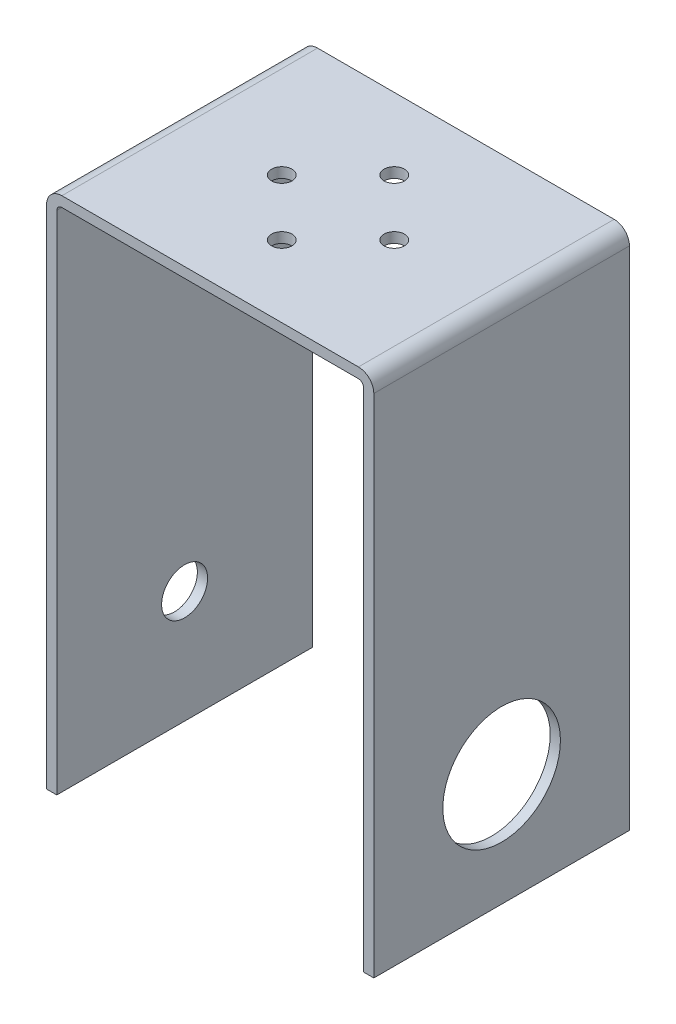
ISO-10303-21;
HEADER;
FILE_DESCRIPTION(('STEP AP214'),'2;1');
FILE_NAME('part.step','',(''),(''),'','','');
FILE_SCHEMA(('AUTOMOTIVE_DESIGN { 1 0 10303 214 1 1 1 1 }'));
ENDSEC;
DATA;
#1=APPLICATION_CONTEXT('core data for automotive mechanical design processes');
#2=APPLICATION_PROTOCOL_DEFINITION('international standard','automotive_design',2000,#1);
#3=PRODUCT_CONTEXT('',#1,'mechanical');
#4=PRODUCT('Part','Part','',(#3));
#5=PRODUCT_RELATED_PRODUCT_CATEGORY('part','',(#4));
#6=PRODUCT_DEFINITION_FORMATION('','',#4);
#7=PRODUCT_DEFINITION_CONTEXT('part definition',#1,'design');
#8=PRODUCT_DEFINITION('design','',#6,#7);
#9=PRODUCT_DEFINITION_SHAPE('','',#8);
#10=(LENGTH_UNIT() NAMED_UNIT(*) SI_UNIT(.MILLI.,.METRE.));
#11=(NAMED_UNIT(*) PLANE_ANGLE_UNIT() SI_UNIT($,.RADIAN.));
#12=(NAMED_UNIT(*) SI_UNIT($,.STERADIAN.) SOLID_ANGLE_UNIT());
#13=UNCERTAINTY_MEASURE_WITH_UNIT(LENGTH_MEASURE(1.E-05),#10,'distance_accuracy_value','');
#14=(GEOMETRIC_REPRESENTATION_CONTEXT(3) GLOBAL_UNCERTAINTY_ASSIGNED_CONTEXT((#13)) GLOBAL_UNIT_ASSIGNED_CONTEXT((#10,
#11,#12)) REPRESENTATION_CONTEXT('',''));
#15=CARTESIAN_POINT('',(0.,0.,0.));
#16=DIRECTION('',(0.,0.,1.));
#17=DIRECTION('',(1.,0.,0.));
#18=AXIS2_PLACEMENT_3D('',#15,#16,#17);
#19=CARTESIAN_POINT('',(30.,-50.,50.));
#20=DIRECTION('',(1.,0.,0.));
#21=DIRECTION('',(0.,0.,-1.));
#22=AXIS2_PLACEMENT_3D('',#19,#20,#21);
#23=PLANE('',#22);
#24=CARTESIAN_POINT('',(30.,-28.,25.));
#25=DIRECTION('',(1.,0.,0.));
#26=DIRECTION('',(0.,0.,-1.));
#27=AXIS2_PLACEMENT_3D('',#24,#25,#26);
#28=CIRCLE('',#27,11.5);
#29=CARTESIAN_POINT('',(30.,-28.,13.5));
#30=VERTEX_POINT('',#29);
#31=EDGE_CURVE('E357',#30,#30,#28,.T.);
#32=ORIENTED_EDGE('',*,*,#31,.T.);
#33=EDGE_LOOP('',(#32));
#34=FACE_BOUND('',#33,.T.);
#35=DIRECTION('',(0.,-1.,0.));
#36=VECTOR('',#35,1.);
#37=CARTESIAN_POINT('',(30.,-50.,50.));
#38=LINE('',#37,#36);
#39=CARTESIAN_POINT('',(30.,49.,50.));
#40=VERTEX_POINT('',#39);
#41=CARTESIAN_POINT('',(30.,-50.,50.));
#42=VERTEX_POINT('',#41);
#43=EDGE_CURVE('E137',#40,#42,#38,.T.);
#44=ORIENTED_EDGE('',*,*,#43,.F.);
#45=DIRECTION('',(0.,0.,-1.));
#46=VECTOR('',#45,1.);
#47=CARTESIAN_POINT('',(30.,49.,0.));
#48=LINE('',#47,#46);
#49=CARTESIAN_POINT('',(30.,49.,0.));
#50=VERTEX_POINT('',#49);
#51=EDGE_CURVE('E162',#40,#50,#48,.T.);
#52=ORIENTED_EDGE('',*,*,#51,.T.);
#53=DIRECTION('',(0.,-1.,0.));
#54=VECTOR('',#53,1.);
#55=CARTESIAN_POINT('',(30.,-50.,0.));
#56=LINE('',#55,#54);
#57=CARTESIAN_POINT('',(30.,-50.,0.));
#58=VERTEX_POINT('',#57);
#59=EDGE_CURVE('E160',#50,#58,#56,.T.);
#60=ORIENTED_EDGE('',*,*,#59,.T.);
#61=DIRECTION('',(0.,0.,-1.));
#62=VECTOR('',#61,1.);
#63=CARTESIAN_POINT('',(30.,-50.,50.));
#64=LINE('',#63,#62);
#65=EDGE_CURVE('E154',#42,#58,#64,.T.);
#66=ORIENTED_EDGE('',*,*,#65,.F.);
#67=EDGE_LOOP('',(#44,#52,#60,#66));
#68=FACE_BOUND('',#67,.T.);
#69=ADVANCED_FACE('F45',(#34,#68),#23,.F.);
#70=CARTESIAN_POINT('',(30.,-50.,50.));
#71=DIRECTION('',(0.,1.,0.));
#72=DIRECTION('',(0.,0.,1.));
#73=AXIS2_PLACEMENT_3D('',#70,#71,#72);
#74=PLANE('',#73);
#75=DIRECTION('',(1.,0.,0.));
#76=VECTOR('',#75,1.);
#77=CARTESIAN_POINT('',(30.,-50.,0.));
#78=LINE('',#77,#76);
#79=CARTESIAN_POINT('',(32.,-50.,0.));
#80=VERTEX_POINT('',#79);
#81=EDGE_CURVE('E234',#58,#80,#78,.T.);
#82=ORIENTED_EDGE('',*,*,#81,.T.);
#83=DIRECTION('',(0.,0.,-1.));
#84=VECTOR('',#83,1.);
#85=CARTESIAN_POINT('',(32.,-50.,50.));
#86=LINE('',#85,#84);
#87=CARTESIAN_POINT('',(32.,-50.,50.));
#88=VERTEX_POINT('',#87);
#89=EDGE_CURVE('E156',#88,#80,#86,.T.);
#90=ORIENTED_EDGE('',*,*,#89,.F.);
#91=DIRECTION('',(1.,0.,0.));
#92=VECTOR('',#91,1.);
#93=CARTESIAN_POINT('',(30.,-50.,50.));
#94=LINE('',#93,#92);
#95=EDGE_CURVE('E140',#42,#88,#94,.T.);
#96=ORIENTED_EDGE('',*,*,#95,.F.);
#97=ORIENTED_EDGE('',*,*,#65,.T.);
#98=EDGE_LOOP('',(#82,#90,#96,#97));
#99=FACE_BOUND('',#98,.T.);
#100=ADVANCED_FACE('F153',(#99),#74,.F.);
#101=CARTESIAN_POINT('',(32.,-50.,50.));
#102=DIRECTION('',(-1.,0.,0.));
#103=DIRECTION('',(0.,0.,1.));
#104=AXIS2_PLACEMENT_3D('',#101,#102,#103);
#105=PLANE('',#104);
#106=CARTESIAN_POINT('',(32.,-28.,25.));
#107=DIRECTION('',(1.,0.,0.));
#108=DIRECTION('',(0.,0.,-1.));
#109=AXIS2_PLACEMENT_3D('',#106,#107,#108);
#110=CIRCLE('',#109,11.5);
#111=CARTESIAN_POINT('',(32.,-28.,13.5));
#112=VERTEX_POINT('',#111);
#113=EDGE_CURVE('E353',#112,#112,#110,.T.);
#114=ORIENTED_EDGE('',*,*,#113,.F.);
#115=EDGE_LOOP('',(#114));
#116=FACE_BOUND('',#115,.T.);
#117=DIRECTION('',(0.,1.,0.));
#118=VECTOR('',#117,1.);
#119=CARTESIAN_POINT('',(32.,-50.,0.));
#120=LINE('',#119,#118);
#121=CARTESIAN_POINT('',(32.,49.,0.));
#122=VERTEX_POINT('',#121);
#123=EDGE_CURVE('E236',#80,#122,#120,.T.);
#124=ORIENTED_EDGE('',*,*,#123,.T.);
#125=DIRECTION('',(0.,0.,-1.));
#126=VECTOR('',#125,1.);
#127=CARTESIAN_POINT('',(32.,49.,50.));
#128=LINE('',#127,#126);
#129=CARTESIAN_POINT('',(32.,49.,50.));
#130=VERTEX_POINT('',#129);
#131=EDGE_CURVE('E70',#122,#130,#128,.F.);
#132=ORIENTED_EDGE('',*,*,#131,.T.);
#133=DIRECTION('',(0.,1.,0.));
#134=VECTOR('',#133,1.);
#135=CARTESIAN_POINT('',(32.,-50.,50.));
#136=LINE('',#135,#134);
#137=EDGE_CURVE('E157',#88,#130,#136,.T.);
#138=ORIENTED_EDGE('',*,*,#137,.F.);
#139=ORIENTED_EDGE('',*,*,#89,.T.);
#140=EDGE_LOOP('',(#124,#132,#138,#139));
#141=FACE_BOUND('',#140,.T.);
#142=ADVANCED_FACE('F280',(#116,#141),#105,.F.);
#143=CARTESIAN_POINT('',(-32.,52.,50.));
#144=DIRECTION('',(0.,-1.,0.));
#145=DIRECTION('',(0.,0.,-1.));
#146=AXIS2_PLACEMENT_3D('',#143,#144,#145);
#147=PLANE('',#146);
#148=CARTESIAN_POINT('',(-11.,52.,25.));
#149=DIRECTION('',(0.,1.,0.));
#150=DIRECTION('',(0.,0.,1.));
#151=AXIS2_PLACEMENT_3D('',#148,#149,#150);
#152=CIRCLE('',#151,2.);
#153=CARTESIAN_POINT('',(-11.,52.,27.));
#154=VERTEX_POINT('',#153);
#155=EDGE_CURVE('E214',#154,#154,#152,.T.);
#156=ORIENTED_EDGE('',*,*,#155,.F.);
#157=EDGE_LOOP('',(#156));
#158=FACE_BOUND('',#157,.T.);
#159=CARTESIAN_POINT('',(0.,52.,36.));
#160=DIRECTION('',(0.,1.,0.));
#161=DIRECTION('',(0.,0.,1.));
#162=AXIS2_PLACEMENT_3D('',#159,#160,#161);
#163=CIRCLE('',#162,2.);
#164=CARTESIAN_POINT('',(0.,52.,38.));
#165=VERTEX_POINT('',#164);
#166=EDGE_CURVE('E204',#165,#165,#163,.T.);
#167=ORIENTED_EDGE('',*,*,#166,.F.);
#168=EDGE_LOOP('',(#167));
#169=FACE_BOUND('',#168,.T.);
#170=CARTESIAN_POINT('',(11.,52.,25.));
#171=DIRECTION('',(0.,1.,0.));
#172=DIRECTION('',(0.,0.,1.));
#173=AXIS2_PLACEMENT_3D('',#170,#171,#172);
#174=CIRCLE('',#173,2.);
#175=CARTESIAN_POINT('',(11.,52.,27.));
#176=VERTEX_POINT('',#175);
#177=EDGE_CURVE('E201',#176,#176,#174,.T.);
#178=ORIENTED_EDGE('',*,*,#177,.F.);
#179=EDGE_LOOP('',(#178));
#180=FACE_BOUND('',#179,.T.);
#181=CARTESIAN_POINT('',(0.,52.,14.));
#182=DIRECTION('',(0.,1.,0.));
#183=DIRECTION('',(0.,0.,1.));
#184=AXIS2_PLACEMENT_3D('',#181,#182,#183);
#185=CIRCLE('',#184,2.);
#186=CARTESIAN_POINT('',(0.,52.,16.));
#187=VERTEX_POINT('',#186);
#188=EDGE_CURVE('E198',#187,#187,#185,.T.);
#189=ORIENTED_EDGE('',*,*,#188,.F.);
#190=EDGE_LOOP('',(#189));
#191=FACE_BOUND('',#190,.T.);
#192=DIRECTION('',(-1.,0.,0.));
#193=VECTOR('',#192,1.);
#194=CARTESIAN_POINT('',(-32.,52.,50.));
#195=LINE('',#194,#193);
#196=CARTESIAN_POINT('',(29.,52.,50.));
#197=VERTEX_POINT('',#196);
#198=CARTESIAN_POINT('',(-29.,52.,50.));
#199=VERTEX_POINT('',#198);
#200=EDGE_CURVE('E221',#197,#199,#195,.T.);
#201=ORIENTED_EDGE('',*,*,#200,.F.);
#202=DIRECTION('',(0.,0.,-1.));
#203=VECTOR('',#202,1.);
#204=CARTESIAN_POINT('',(29.,52.,50.));
#205=LINE('',#204,#203);
#206=CARTESIAN_POINT('',(29.,52.,0.));
#207=VERTEX_POINT('',#206);
#208=EDGE_CURVE('E185',#197,#207,#205,.T.);
#209=ORIENTED_EDGE('',*,*,#208,.T.);
#210=DIRECTION('',(-1.,0.,0.));
#211=VECTOR('',#210,1.);
#212=CARTESIAN_POINT('',(-32.,52.,0.));
#213=LINE('',#212,#211);
#214=CARTESIAN_POINT('',(-29.,52.,0.));
#215=VERTEX_POINT('',#214);
#216=EDGE_CURVE('E238',#207,#215,#213,.T.);
#217=ORIENTED_EDGE('',*,*,#216,.T.);
#218=DIRECTION('',(0.,0.,-1.));
#219=VECTOR('',#218,1.);
#220=CARTESIAN_POINT('',(-29.,52.,50.));
#221=LINE('',#220,#219);
#222=EDGE_CURVE('E183',#215,#199,#221,.F.);
#223=ORIENTED_EDGE('',*,*,#222,.T.);
#224=EDGE_LOOP('',(#201,#209,#217,#223));
#225=FACE_BOUND('',#224,.T.);
#226=ADVANCED_FACE('F287',(#158,#169,#180,#191,#225),#147,.F.);
#227=CARTESIAN_POINT('',(-32.,-50.,50.));
#228=DIRECTION('',(1.,0.,0.));
#229=DIRECTION('',(0.,0.,-1.));
#230=AXIS2_PLACEMENT_3D('',#227,#228,#229);
#231=PLANE('',#230);
#232=CARTESIAN_POINT('',(-32.,-28.,25.));
#233=DIRECTION('',(1.,0.,0.));
#234=DIRECTION('',(0.,0.,-1.));
#235=AXIS2_PLACEMENT_3D('',#232,#233,#234);
#236=CIRCLE('',#235,4.5);
#237=CARTESIAN_POINT('',(-32.,-28.,20.5));
#238=VERTEX_POINT('',#237);
#239=EDGE_CURVE('E351',#238,#238,#236,.T.);
#240=ORIENTED_EDGE('',*,*,#239,.T.);
#241=EDGE_LOOP('',(#240));
#242=FACE_BOUND('',#241,.T.);
#243=DIRECTION('',(0.,-1.,0.));
#244=VECTOR('',#243,1.);
#245=CARTESIAN_POINT('',(-32.,-50.,50.));
#246=LINE('',#245,#244);
#247=CARTESIAN_POINT('',(-32.,49.,50.));
#248=VERTEX_POINT('',#247);
#249=CARTESIAN_POINT('',(-32.,-50.,50.));
#250=VERTEX_POINT('',#249);
#251=EDGE_CURVE('E223',#248,#250,#246,.T.);
#252=ORIENTED_EDGE('',*,*,#251,.F.);
#253=DIRECTION('',(0.,0.,-1.));
#254=VECTOR('',#253,1.);
#255=CARTESIAN_POINT('',(-32.,49.,50.));
#256=LINE('',#255,#254);
#257=CARTESIAN_POINT('',(-32.,49.,0.));
#258=VERTEX_POINT('',#257);
#259=EDGE_CURVE('E13',#248,#258,#256,.T.);
#260=ORIENTED_EDGE('',*,*,#259,.T.);
#261=DIRECTION('',(0.,-1.,0.));
#262=VECTOR('',#261,1.);
#263=CARTESIAN_POINT('',(-32.,-50.,0.));
#264=LINE('',#263,#262);
#265=CARTESIAN_POINT('',(-32.,-50.,0.));
#266=VERTEX_POINT('',#265);
#267=EDGE_CURVE('E241',#258,#266,#264,.T.);
#268=ORIENTED_EDGE('',*,*,#267,.T.);
#269=DIRECTION('',(0.,0.,-1.));
#270=VECTOR('',#269,1.);
#271=CARTESIAN_POINT('',(-32.,-50.,50.));
#272=LINE('',#271,#270);
#273=EDGE_CURVE('E166',#250,#266,#272,.T.);
#274=ORIENTED_EDGE('',*,*,#273,.F.);
#275=EDGE_LOOP('',(#252,#260,#268,#274));
#276=FACE_BOUND('',#275,.T.);
#277=ADVANCED_FACE('F291',(#242,#276),#231,.F.);
#278=CARTESIAN_POINT('',(-32.,-50.,50.));
#279=DIRECTION('',(0.,1.,0.));
#280=DIRECTION('',(0.,0.,1.));
#281=AXIS2_PLACEMENT_3D('',#278,#279,#280);
#282=PLANE('',#281);
#283=DIRECTION('',(1.,0.,0.));
#284=VECTOR('',#283,1.);
#285=CARTESIAN_POINT('',(-32.,-50.,0.));
#286=LINE('',#285,#284);
#287=CARTESIAN_POINT('',(-30.,-50.,0.));
#288=VERTEX_POINT('',#287);
#289=EDGE_CURVE('E243',#266,#288,#286,.T.);
#290=ORIENTED_EDGE('',*,*,#289,.T.);
#291=DIRECTION('',(0.,0.,-1.));
#292=VECTOR('',#291,1.);
#293=CARTESIAN_POINT('',(-30.,-50.,50.));
#294=LINE('',#293,#292);
#295=CARTESIAN_POINT('',(-30.,-50.,50.));
#296=VERTEX_POINT('',#295);
#297=EDGE_CURVE('E232',#296,#288,#294,.T.);
#298=ORIENTED_EDGE('',*,*,#297,.F.);
#299=DIRECTION('',(1.,0.,0.));
#300=VECTOR('',#299,1.);
#301=CARTESIAN_POINT('',(-32.,-50.,50.));
#302=LINE('',#301,#300);
#303=EDGE_CURVE('E225',#250,#296,#302,.T.);
#304=ORIENTED_EDGE('',*,*,#303,.F.);
#305=ORIENTED_EDGE('',*,*,#273,.T.);
#306=EDGE_LOOP('',(#290,#298,#304,#305));
#307=FACE_BOUND('',#306,.T.);
#308=ADVANCED_FACE('F256',(#307),#282,.F.);
#309=CARTESIAN_POINT('',(-30.,-50.,50.));
#310=DIRECTION('',(-1.,0.,0.));
#311=DIRECTION('',(0.,0.,1.));
#312=AXIS2_PLACEMENT_3D('',#309,#310,#311);
#313=PLANE('',#312);
#314=CARTESIAN_POINT('',(-30.,-28.,25.));
#315=DIRECTION('',(1.,0.,0.));
#316=DIRECTION('',(0.,0.,-1.));
#317=AXIS2_PLACEMENT_3D('',#314,#315,#316);
#318=CIRCLE('',#317,4.5);
#319=CARTESIAN_POINT('',(-30.,-28.,20.5));
#320=VERTEX_POINT('',#319);
#321=EDGE_CURVE('E349',#320,#320,#318,.T.);
#322=ORIENTED_EDGE('',*,*,#321,.F.);
#323=EDGE_LOOP('',(#322));
#324=FACE_BOUND('',#323,.T.);
#325=DIRECTION('',(0.,1.,0.));
#326=VECTOR('',#325,1.);
#327=CARTESIAN_POINT('',(-30.,-50.,0.));
#328=LINE('',#327,#326);
#329=CARTESIAN_POINT('',(-30.,49.,0.));
#330=VERTEX_POINT('',#329);
#331=EDGE_CURVE('E245',#288,#330,#328,.T.);
#332=ORIENTED_EDGE('',*,*,#331,.T.);
#333=DIRECTION('',(0.,0.,-1.));
#334=VECTOR('',#333,1.);
#335=CARTESIAN_POINT('',(-30.,49.,50.));
#336=LINE('',#335,#334);
#337=CARTESIAN_POINT('',(-30.,49.,50.));
#338=VERTEX_POINT('',#337);
#339=EDGE_CURVE('E174',#330,#338,#336,.F.);
#340=ORIENTED_EDGE('',*,*,#339,.T.);
#341=DIRECTION('',(0.,1.,0.));
#342=VECTOR('',#341,1.);
#343=CARTESIAN_POINT('',(-30.,-50.,50.));
#344=LINE('',#343,#342);
#345=EDGE_CURVE('E227',#296,#338,#344,.T.);
#346=ORIENTED_EDGE('',*,*,#345,.F.);
#347=ORIENTED_EDGE('',*,*,#297,.T.);
#348=EDGE_LOOP('',(#332,#340,#346,#347));
#349=FACE_BOUND('',#348,.T.);
#350=ADVANCED_FACE('F267',(#324,#349),#313,.F.);
#351=CARTESIAN_POINT('',(-30.,50.,50.));
#352=DIRECTION('',(0.,1.,0.));
#353=DIRECTION('',(0.,0.,1.));
#354=AXIS2_PLACEMENT_3D('',#351,#352,#353);
#355=PLANE('',#354);
#356=CARTESIAN_POINT('',(-11.,50.,25.));
#357=DIRECTION('',(0.,1.,0.));
#358=DIRECTION('',(0.,0.,1.));
#359=AXIS2_PLACEMENT_3D('',#356,#357,#358);
#360=CIRCLE('',#359,2.);
#361=CARTESIAN_POINT('',(-11.,50.,27.));
#362=VERTEX_POINT('',#361);
#363=EDGE_CURVE('E49',#362,#362,#360,.T.);
#364=ORIENTED_EDGE('',*,*,#363,.T.);
#365=EDGE_LOOP('',(#364));
#366=FACE_BOUND('',#365,.T.);
#367=CARTESIAN_POINT('',(0.,50.,36.));
#368=DIRECTION('',(0.,1.,0.));
#369=DIRECTION('',(0.,0.,1.));
#370=AXIS2_PLACEMENT_3D('',#367,#368,#369);
#371=CIRCLE('',#370,2.);
#372=CARTESIAN_POINT('',(0.,50.,38.));
#373=VERTEX_POINT('',#372);
#374=EDGE_CURVE('E202',#373,#373,#371,.T.);
#375=ORIENTED_EDGE('',*,*,#374,.T.);
#376=EDGE_LOOP('',(#375));
#377=FACE_BOUND('',#376,.T.);
#378=CARTESIAN_POINT('',(11.,50.,25.));
#379=DIRECTION('',(0.,1.,0.));
#380=DIRECTION('',(0.,0.,1.));
#381=AXIS2_PLACEMENT_3D('',#378,#379,#380);
#382=CIRCLE('',#381,2.);
#383=CARTESIAN_POINT('',(11.,50.,27.));
#384=VERTEX_POINT('',#383);
#385=EDGE_CURVE('E199',#384,#384,#382,.T.);
#386=ORIENTED_EDGE('',*,*,#385,.T.);
#387=EDGE_LOOP('',(#386));
#388=FACE_BOUND('',#387,.T.);
#389=CARTESIAN_POINT('',(0.,50.,14.));
#390=DIRECTION('',(0.,1.,0.));
#391=DIRECTION('',(0.,0.,1.));
#392=AXIS2_PLACEMENT_3D('',#389,#390,#391);
#393=CIRCLE('',#392,2.);
#394=CARTESIAN_POINT('',(0.,50.,16.));
#395=VERTEX_POINT('',#394);
#396=EDGE_CURVE('E195',#395,#395,#393,.T.);
#397=ORIENTED_EDGE('',*,*,#396,.T.);
#398=EDGE_LOOP('',(#397));
#399=FACE_BOUND('',#398,.T.);
#400=DIRECTION('',(1.,0.,0.));
#401=VECTOR('',#400,1.);
#402=CARTESIAN_POINT('',(-30.,50.,0.));
#403=LINE('',#402,#401);
#404=CARTESIAN_POINT('',(-29.,50.,0.));
#405=VERTEX_POINT('',#404);
#406=CARTESIAN_POINT('',(29.,50.,0.));
#407=VERTEX_POINT('',#406);
#408=EDGE_CURVE('E149',#405,#407,#403,.T.);
#409=ORIENTED_EDGE('',*,*,#408,.T.);
#410=DIRECTION('',(0.,0.,-1.));
#411=VECTOR('',#410,1.);
#412=CARTESIAN_POINT('',(29.,50.,50.));
#413=LINE('',#412,#411);
#414=CARTESIAN_POINT('',(29.,50.,50.));
#415=VERTEX_POINT('',#414);
#416=EDGE_CURVE('E172',#407,#415,#413,.F.);
#417=ORIENTED_EDGE('',*,*,#416,.T.);
#418=DIRECTION('',(1.,0.,0.));
#419=VECTOR('',#418,1.);
#420=CARTESIAN_POINT('',(-30.,50.,50.));
#421=LINE('',#420,#419);
#422=CARTESIAN_POINT('',(-29.,50.,50.));
#423=VERTEX_POINT('',#422);
#424=EDGE_CURVE('E230',#423,#415,#421,.T.);
#425=ORIENTED_EDGE('',*,*,#424,.F.);
#426=DIRECTION('',(0.,0.,-1.));
#427=VECTOR('',#426,1.);
#428=CARTESIAN_POINT('',(-29.,50.,0.));
#429=LINE('',#428,#427);
#430=EDGE_CURVE('E164',#423,#405,#429,.T.);
#431=ORIENTED_EDGE('',*,*,#430,.T.);
#432=EDGE_LOOP('',(#409,#417,#425,#431));
#433=FACE_BOUND('',#432,.T.);
#434=ADVANCED_FACE('F275',(#366,#377,#388,#399,#433),#355,.F.);
#435=CARTESIAN_POINT('',(0.,0.,50.));
#436=DIRECTION('',(0.,0.,-1.));
#437=DIRECTION('',(-1.,0.,0.));
#438=AXIS2_PLACEMENT_3D('',#435,#436,#437);
#439=PLANE('',#438);
#440=ORIENTED_EDGE('',*,*,#137,.T.);
#441=CARTESIAN_POINT('',(29.,49.,50.));
#442=DIRECTION('',(0.,0.,-1.));
#443=DIRECTION('',(-1.,0.,0.));
#444=AXIS2_PLACEMENT_3D('',#441,#442,#443);
#445=CIRCLE('',#444,3.);
#446=EDGE_CURVE('E54',#130,#197,#445,.F.);
#447=ORIENTED_EDGE('',*,*,#446,.T.);
#448=ORIENTED_EDGE('',*,*,#200,.T.);
#449=CARTESIAN_POINT('',(-29.,49.,50.));
#450=DIRECTION('',(0.,0.,-1.));
#451=DIRECTION('',(-1.,0.,0.));
#452=AXIS2_PLACEMENT_3D('',#449,#450,#451);
#453=CIRCLE('',#452,3.);
#454=EDGE_CURVE('E62',#199,#248,#453,.F.);
#455=ORIENTED_EDGE('',*,*,#454,.T.);
#456=ORIENTED_EDGE('',*,*,#251,.T.);
#457=ORIENTED_EDGE('',*,*,#303,.T.);
#458=ORIENTED_EDGE('',*,*,#345,.T.);
#459=CARTESIAN_POINT('',(-29.,49.,50.));
#460=DIRECTION('',(0.,0.,-1.));
#461=DIRECTION('',(-1.,0.,0.));
#462=AXIS2_PLACEMENT_3D('',#459,#460,#461);
#463=CIRCLE('',#462,1.);
#464=EDGE_CURVE('E181',#338,#423,#463,.T.);
#465=ORIENTED_EDGE('',*,*,#464,.T.);
#466=ORIENTED_EDGE('',*,*,#424,.T.);
#467=CARTESIAN_POINT('',(29.,49.,50.));
#468=DIRECTION('',(0.,0.,-1.));
#469=DIRECTION('',(-1.,0.,0.));
#470=AXIS2_PLACEMENT_3D('',#467,#468,#469);
#471=CIRCLE('',#470,1.);
#472=EDGE_CURVE('E144',#415,#40,#471,.T.);
#473=ORIENTED_EDGE('',*,*,#472,.T.);
#474=ORIENTED_EDGE('',*,*,#43,.T.);
#475=ORIENTED_EDGE('',*,*,#95,.T.);
#476=EDGE_LOOP('',(#440,#447,#448,#455,#456,#457,#458,#465,#466,#473,#474,#475));
#477=FACE_BOUND('',#476,.T.);
#478=ADVANCED_FACE('F139',(#477),#439,.F.);
#479=CARTESIAN_POINT('',(0.,0.,0.));
#480=DIRECTION('',(0.,0.,-1.));
#481=DIRECTION('',(-1.,0.,0.));
#482=AXIS2_PLACEMENT_3D('',#479,#480,#481);
#483=PLANE('',#482);
#484=ORIENTED_EDGE('',*,*,#216,.F.);
#485=CARTESIAN_POINT('',(29.,49.,0.));
#486=DIRECTION('',(0.,0.,-1.));
#487=DIRECTION('',(-1.,0.,0.));
#488=AXIS2_PLACEMENT_3D('',#485,#486,#487);
#489=CIRCLE('',#488,3.);
#490=EDGE_CURVE('E190',#207,#122,#489,.T.);
#491=ORIENTED_EDGE('',*,*,#490,.T.);
#492=ORIENTED_EDGE('',*,*,#123,.F.);
#493=ORIENTED_EDGE('',*,*,#81,.F.);
#494=ORIENTED_EDGE('',*,*,#59,.F.);
#495=CARTESIAN_POINT('',(29.,49.,0.));
#496=DIRECTION('',(0.,0.,-1.));
#497=DIRECTION('',(-1.,0.,0.));
#498=AXIS2_PLACEMENT_3D('',#495,#496,#497);
#499=CIRCLE('',#498,1.);
#500=EDGE_CURVE('E176',#50,#407,#499,.F.);
#501=ORIENTED_EDGE('',*,*,#500,.T.);
#502=ORIENTED_EDGE('',*,*,#408,.F.);
#503=CARTESIAN_POINT('',(-29.,49.,0.));
#504=DIRECTION('',(0.,0.,-1.));
#505=DIRECTION('',(-1.,0.,0.));
#506=AXIS2_PLACEMENT_3D('',#503,#504,#505);
#507=CIRCLE('',#506,1.);
#508=EDGE_CURVE('E179',#405,#330,#507,.F.);
#509=ORIENTED_EDGE('',*,*,#508,.T.);
#510=ORIENTED_EDGE('',*,*,#331,.F.);
#511=ORIENTED_EDGE('',*,*,#289,.F.);
#512=ORIENTED_EDGE('',*,*,#267,.F.);
#513=CARTESIAN_POINT('',(-29.,49.,0.));
#514=DIRECTION('',(0.,0.,-1.));
#515=DIRECTION('',(-1.,0.,0.));
#516=AXIS2_PLACEMENT_3D('',#513,#514,#515);
#517=CIRCLE('',#516,3.);
#518=EDGE_CURVE('E188',#258,#215,#517,.T.);
#519=ORIENTED_EDGE('',*,*,#518,.T.);
#520=EDGE_LOOP('',(#484,#491,#492,#493,#494,#501,#502,#509,#510,#511,#512,#519));
#521=FACE_BOUND('',#520,.T.);
#522=ADVANCED_FACE('F263',(#521),#483,.T.);
#523=CARTESIAN_POINT('',(29.,49.,50.));
#524=DIRECTION('',(0.,0.,1.));
#525=DIRECTION('',(1.,0.,0.));
#526=AXIS2_PLACEMENT_3D('',#523,#524,#525);
#527=CYLINDRICAL_SURFACE('',#526,1.);
#528=ORIENTED_EDGE('',*,*,#472,.F.);
#529=ORIENTED_EDGE('',*,*,#416,.F.);
#530=ORIENTED_EDGE('',*,*,#500,.F.);
#531=ORIENTED_EDGE('',*,*,#51,.F.);
#532=EDGE_LOOP('',(#528,#529,#530,#531));
#533=FACE_BOUND('',#532,.T.);
#534=ADVANCED_FACE('F278',(#533),#527,.F.);
#535=CARTESIAN_POINT('',(-29.,49.,50.));
#536=DIRECTION('',(0.,0.,1.));
#537=DIRECTION('',(1.,0.,0.));
#538=AXIS2_PLACEMENT_3D('',#535,#536,#537);
#539=CYLINDRICAL_SURFACE('',#538,1.);
#540=ORIENTED_EDGE('',*,*,#464,.F.);
#541=ORIENTED_EDGE('',*,*,#339,.F.);
#542=ORIENTED_EDGE('',*,*,#508,.F.);
#543=ORIENTED_EDGE('',*,*,#430,.F.);
#544=EDGE_LOOP('',(#540,#541,#542,#543));
#545=FACE_BOUND('',#544,.T.);
#546=ADVANCED_FACE('F271',(#545),#539,.F.);
#547=CARTESIAN_POINT('',(29.,49.,50.));
#548=DIRECTION('',(0.,0.,-1.));
#549=DIRECTION('',(-1.,0.,0.));
#550=AXIS2_PLACEMENT_3D('',#547,#548,#549);
#551=CYLINDRICAL_SURFACE('',#550,3.);
#552=ORIENTED_EDGE('',*,*,#446,.F.);
#553=ORIENTED_EDGE('',*,*,#131,.F.);
#554=ORIENTED_EDGE('',*,*,#490,.F.);
#555=ORIENTED_EDGE('',*,*,#208,.F.);
#556=EDGE_LOOP('',(#552,#553,#554,#555));
#557=FACE_BOUND('',#556,.T.);
#558=ADVANCED_FACE('F285',(#557),#551,.T.);
#559=CARTESIAN_POINT('',(-29.,49.,50.));
#560=DIRECTION('',(0.,0.,-1.));
#561=DIRECTION('',(-1.,0.,0.));
#562=AXIS2_PLACEMENT_3D('',#559,#560,#561);
#563=CYLINDRICAL_SURFACE('',#562,3.);
#564=ORIENTED_EDGE('',*,*,#454,.F.);
#565=ORIENTED_EDGE('',*,*,#222,.F.);
#566=ORIENTED_EDGE('',*,*,#518,.F.);
#567=ORIENTED_EDGE('',*,*,#259,.F.);
#568=EDGE_LOOP('',(#564,#565,#566,#567));
#569=FACE_BOUND('',#568,.T.);
#570=ADVANCED_FACE('F47',(#569),#563,.T.);
#571=CARTESIAN_POINT('',(0.,42.,14.));
#572=DIRECTION('',(0.,1.,0.));
#573=DIRECTION('',(0.,0.,1.));
#574=AXIS2_PLACEMENT_3D('',#571,#572,#573);
#575=CYLINDRICAL_SURFACE('',#574,2.);
#576=ORIENTED_EDGE('',*,*,#188,.T.);
#577=EDGE_LOOP('',(#576));
#578=FACE_BOUND('',#577,.T.);
#579=ORIENTED_EDGE('',*,*,#396,.F.);
#580=EDGE_LOOP('',(#579));
#581=FACE_BOUND('',#580,.T.);
#582=ADVANCED_FACE('F320',(#578,#581),#575,.F.);
#583=CARTESIAN_POINT('',(11.,42.,25.));
#584=DIRECTION('',(0.,1.,0.));
#585=DIRECTION('',(0.,0.,1.));
#586=AXIS2_PLACEMENT_3D('',#583,#584,#585);
#587=CYLINDRICAL_SURFACE('',#586,2.);
#588=ORIENTED_EDGE('',*,*,#177,.T.);
#589=EDGE_LOOP('',(#588));
#590=FACE_BOUND('',#589,.T.);
#591=ORIENTED_EDGE('',*,*,#385,.F.);
#592=EDGE_LOOP('',(#591));
#593=FACE_BOUND('',#592,.T.);
#594=ADVANCED_FACE('F324',(#590,#593),#587,.F.);
#595=CARTESIAN_POINT('',(0.,42.,36.));
#596=DIRECTION('',(0.,1.,0.));
#597=DIRECTION('',(0.,0.,1.));
#598=AXIS2_PLACEMENT_3D('',#595,#596,#597);
#599=CYLINDRICAL_SURFACE('',#598,2.);
#600=ORIENTED_EDGE('',*,*,#166,.T.);
#601=EDGE_LOOP('',(#600));
#602=FACE_BOUND('',#601,.T.);
#603=ORIENTED_EDGE('',*,*,#374,.F.);
#604=EDGE_LOOP('',(#603));
#605=FACE_BOUND('',#604,.T.);
#606=ADVANCED_FACE('F330',(#602,#605),#599,.F.);
#607=CARTESIAN_POINT('',(-11.,42.,25.));
#608=DIRECTION('',(0.,1.,0.));
#609=DIRECTION('',(0.,0.,1.));
#610=AXIS2_PLACEMENT_3D('',#607,#608,#609);
#611=CYLINDRICAL_SURFACE('',#610,2.);
#612=ORIENTED_EDGE('',*,*,#155,.T.);
#613=EDGE_LOOP('',(#612));
#614=FACE_BOUND('',#613,.T.);
#615=ORIENTED_EDGE('',*,*,#363,.F.);
#616=EDGE_LOOP('',(#615));
#617=FACE_BOUND('',#616,.T.);
#618=ADVANCED_FACE('F362',(#614,#617),#611,.F.);
#619=CARTESIAN_POINT('',(15.,-28.,25.));
#620=DIRECTION('',(1.,0.,0.));
#621=DIRECTION('',(0.,0.,-1.));
#622=AXIS2_PLACEMENT_3D('',#619,#620,#621);
#623=CYLINDRICAL_SURFACE('',#622,11.5);
#624=ORIENTED_EDGE('',*,*,#113,.T.);
#625=EDGE_LOOP('',(#624));
#626=FACE_BOUND('',#625,.T.);
#627=ORIENTED_EDGE('',*,*,#31,.F.);
#628=EDGE_LOOP('',(#627));
#629=FACE_BOUND('',#628,.T.);
#630=ADVANCED_FACE('F375',(#626,#629),#623,.F.);
#631=CARTESIAN_POINT('',(-33.,-28.,25.));
#632=DIRECTION('',(1.,0.,0.));
#633=DIRECTION('',(0.,0.,-1.));
#634=AXIS2_PLACEMENT_3D('',#631,#632,#633);
#635=CYLINDRICAL_SURFACE('',#634,4.5);
#636=CARTESIAN_POINT('',(-30.,-28.,20.5));
#637=CARTESIAN_POINT('',(-30.0208333333333,-28.,20.5));
#638=CARTESIAN_POINT('',(-30.0416666666667,-28.,20.5));
#639=CARTESIAN_POINT('',(-30.0833333333333,-28.,20.5));
#640=CARTESIAN_POINT('',(-30.1041666666667,-28.,20.5));
#641=CARTESIAN_POINT('',(-30.1458333333333,-28.,20.5));
#642=CARTESIAN_POINT('',(-30.1666666666667,-28.,20.5));
#643=CARTESIAN_POINT('',(-30.2083333333333,-28.,20.5));
#644=CARTESIAN_POINT('',(-30.2291666666667,-28.,20.5));
#645=CARTESIAN_POINT('',(-30.2708333333333,-28.,20.5));
#646=CARTESIAN_POINT('',(-30.2916666666667,-28.,20.5));
#647=CARTESIAN_POINT('',(-30.3333333333333,-28.,20.5));
#648=CARTESIAN_POINT('',(-30.3541666666667,-28.,20.5));
#649=CARTESIAN_POINT('',(-30.3958333333333,-28.,20.5));
#650=CARTESIAN_POINT('',(-30.4166666666667,-28.,20.5));
#651=CARTESIAN_POINT('',(-30.4583333333333,-28.,20.5));
#652=CARTESIAN_POINT('',(-30.4791666666667,-28.,20.5));
#653=CARTESIAN_POINT('',(-30.5208333333333,-28.,20.5));
#654=CARTESIAN_POINT('',(-30.5416666666667,-28.,20.5));
#655=CARTESIAN_POINT('',(-30.5833333333333,-28.,20.5));
#656=CARTESIAN_POINT('',(-30.6041666666667,-28.,20.5));
#657=CARTESIAN_POINT('',(-30.6458333333333,-28.,20.5));
#658=CARTESIAN_POINT('',(-30.6666666666667,-28.,20.5));
#659=CARTESIAN_POINT('',(-30.7083333333333,-28.,20.5));
#660=CARTESIAN_POINT('',(-30.7291666666667,-28.,20.5));
#661=CARTESIAN_POINT('',(-30.7708333333333,-28.,20.5));
#662=CARTESIAN_POINT('',(-30.7916666666667,-28.,20.5));
#663=CARTESIAN_POINT('',(-30.8333333333333,-28.,20.5));
#664=CARTESIAN_POINT('',(-30.8541666666667,-28.,20.5));
#665=CARTESIAN_POINT('',(-30.8958333333333,-28.,20.5));
#666=CARTESIAN_POINT('',(-30.9166666666667,-28.,20.5));
#667=CARTESIAN_POINT('',(-30.9583333333333,-28.,20.5));
#668=CARTESIAN_POINT('',(-30.9791666666667,-28.,20.5));
#669=CARTESIAN_POINT('',(-31.0208333333333,-28.,20.5));
#670=CARTESIAN_POINT('',(-31.0416666666667,-28.,20.5));
#671=CARTESIAN_POINT('',(-31.0833333333333,-28.,20.5));
#672=CARTESIAN_POINT('',(-31.1041666666667,-28.,20.5));
#673=CARTESIAN_POINT('',(-31.1458333333334,-28.,20.5));
#674=CARTESIAN_POINT('',(-31.1666666666667,-28.,20.5));
#675=CARTESIAN_POINT('',(-31.2083333333333,-28.,20.5));
#676=CARTESIAN_POINT('',(-31.2291666666667,-28.,20.5));
#677=CARTESIAN_POINT('',(-31.2708333333333,-28.,20.5));
#678=CARTESIAN_POINT('',(-31.2916666666667,-28.,20.5));
#679=CARTESIAN_POINT('',(-31.3333333333333,-28.,20.5));
#680=CARTESIAN_POINT('',(-31.3541666666667,-28.,20.5));
#681=CARTESIAN_POINT('',(-31.3958333333333,-28.,20.5));
#682=CARTESIAN_POINT('',(-31.4166666666667,-28.,20.5));
#683=CARTESIAN_POINT('',(-31.4583333333333,-28.,20.5));
#684=CARTESIAN_POINT('',(-31.4791666666667,-28.,20.5));
#685=CARTESIAN_POINT('',(-31.5208333333333,-28.,20.5));
#686=CARTESIAN_POINT('',(-31.5416666666667,-28.,20.5));
#687=CARTESIAN_POINT('',(-31.5833333333333,-28.,20.5));
#688=CARTESIAN_POINT('',(-31.6041666666667,-28.,20.5));
#689=CARTESIAN_POINT('',(-31.6458333333334,-28.,20.5));
#690=CARTESIAN_POINT('',(-31.6666666666667,-28.,20.5));
#691=CARTESIAN_POINT('',(-31.7083333333334,-28.,20.5));
#692=CARTESIAN_POINT('',(-31.7291666666667,-28.,20.5));
#693=CARTESIAN_POINT('',(-31.7708333333334,-28.,20.5));
#694=CARTESIAN_POINT('',(-31.7916666666667,-28.,20.5));
#695=CARTESIAN_POINT('',(-31.8333333333334,-28.,20.5));
#696=CARTESIAN_POINT('',(-31.8541666666667,-28.,20.5));
#697=CARTESIAN_POINT('',(-31.8958333333334,-28.,20.5));
#698=CARTESIAN_POINT('',(-31.9166666666667,-28.,20.5));
#699=CARTESIAN_POINT('',(-31.9583333333334,-28.,20.5));
#700=CARTESIAN_POINT('',(-31.9791666666667,-28.,20.5));
#701=CARTESIAN_POINT('',(-32.,-28.,20.5));
#702=B_SPLINE_CURVE_WITH_KNOTS('',3,(#636,#637,#638,#639,#640,#641,#642,#643,#644,#645,#646,
#647,#648,#649,#650,#651,#652,#653,#654,#655,#656,#657,#658,#659,#660,#661,#662,#663,#664,#665,
#666,#667,#668,#669,#670,#671,#672,#673,#674,#675,#676,#677,#678,#679,#680,#681,#682,#683,#684,
#685,#686,#687,#688,#689,#690,#691,#692,#693,#694,#695,#696,#697,#698,#699,#700,#701),
.UNSPECIFIED.,.F.,.F.,(4,2,2,2,2,2,2,2,2,2,2,2,2,2,2,2,2,2,2,2,2,2,2,2,2,2,2,2,2,2,2,2,4),(0.,
0.0625000000000001,0.125,0.1875,0.25,0.3125,0.375,0.4375,0.5,0.5625,0.625000000000001,
0.687500000000001,0.750000000000001,0.812500000000001,0.875000000000001,0.937500000000001,1.,
1.0625,1.125,1.1875,1.25,1.3125,1.375,1.4375,1.5,1.5625,1.625,1.6875,1.75,1.81250000000001,
1.87500000000001,1.93750000000001,2.00000000000001),.UNSPECIFIED.);
#703=EDGE_CURVE('BSEAM382',#320,#238,#702,.T.);
#704=ORIENTED_EDGE('',*,*,#321,.T.);
#705=ORIENTED_EDGE('',*,*,#239,.F.);
#706=ORIENTED_EDGE('',*,*,#703,.T.);
#707=ORIENTED_EDGE('',*,*,#703,.F.);
#708=EDGE_LOOP('',(#704,#706,#705,#707));
#709=FACE_BOUND('',#708,.T.);
#710=ADVANCED_FACE('F382',(#709),#635,.F.);
#711=CLOSED_SHELL('',(#69,#100,#142,#226,#277,#308,#350,#434,#478,#522,#534,#546,#558,#570,#582,
#594,#606,#618,#630,#710));
#712=MANIFOLD_SOLID_BREP('B2',#711);
#713=ADVANCED_BREP_SHAPE_REPRESENTATION('',(#18,#712),#14);
#714=SHAPE_DEFINITION_REPRESENTATION(#9,#713);
ENDSEC;
END-ISO-10303-21;
